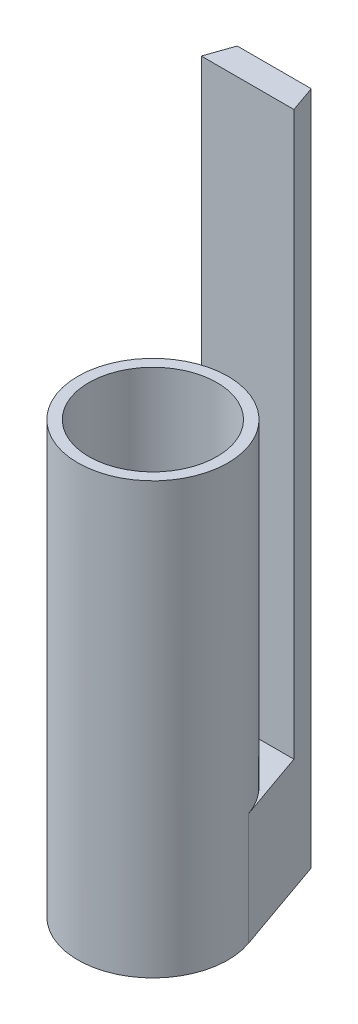
ISO-10303-21;
HEADER;
FILE_DESCRIPTION(('STEP AP214'),'2;1');
FILE_NAME('part.step','',(''),(''),'','','');
FILE_SCHEMA(('AUTOMOTIVE_DESIGN { 1 0 10303 214 1 1 1 1 }'));
ENDSEC;
DATA;
#1=APPLICATION_CONTEXT('core data for automotive mechanical design processes');
#2=APPLICATION_PROTOCOL_DEFINITION('international standard','automotive_design',2000,#1);
#3=PRODUCT_CONTEXT('',#1,'mechanical');
#4=PRODUCT('Part','Part','',(#3));
#5=PRODUCT_RELATED_PRODUCT_CATEGORY('part','',(#4));
#6=PRODUCT_DEFINITION_FORMATION('','',#4);
#7=PRODUCT_DEFINITION_CONTEXT('part definition',#1,'design');
#8=PRODUCT_DEFINITION('design','',#6,#7);
#9=PRODUCT_DEFINITION_SHAPE('','',#8);
#10=(LENGTH_UNIT() NAMED_UNIT(*) SI_UNIT(.MILLI.,.METRE.));
#11=(NAMED_UNIT(*) PLANE_ANGLE_UNIT() SI_UNIT($,.RADIAN.));
#12=(NAMED_UNIT(*) SI_UNIT($,.STERADIAN.) SOLID_ANGLE_UNIT());
#13=UNCERTAINTY_MEASURE_WITH_UNIT(LENGTH_MEASURE(1.E-05),#10,'distance_accuracy_value','');
#14=(GEOMETRIC_REPRESENTATION_CONTEXT(3) GLOBAL_UNCERTAINTY_ASSIGNED_CONTEXT((#13)) GLOBAL_UNIT_ASSIGNED_CONTEXT((#10,
#11,#12)) REPRESENTATION_CONTEXT('',''));
#15=CARTESIAN_POINT('',(0.,0.,0.));
#16=DIRECTION('',(0.,0.,1.));
#17=DIRECTION('',(1.,0.,0.));
#18=AXIS2_PLACEMENT_3D('',#15,#16,#17);
#19=CARTESIAN_POINT('',(0.,8.,0.));
#20=DIRECTION('',(0.,1.,0.));
#21=DIRECTION('',(0.,0.,1.));
#22=AXIS2_PLACEMENT_3D('',#19,#20,#21);
#23=PLANE('',#22);
#24=DIRECTION('',(0.331049570425705,0.,0.94361336463668));
#25=VECTOR('',#24,1.);
#26=CARTESIAN_POINT('',(5.04833150080624,8.,-1.77111520177752));
#27=LINE('',#26,#25);
#28=CARTESIAN_POINT('',(3.30158041034743,8.,-6.75));
#29=VERTEX_POINT('',#28);
#30=CARTESIAN_POINT('',(5.04833150080624,8.,-1.77111520177752));
#31=VERTEX_POINT('',#30);
#32=EDGE_CURVE('E57',#29,#31,#27,.T.);
#33=ORIENTED_EDGE('',*,*,#32,.F.);
#34=DIRECTION('',(1.,0.,0.));
#35=VECTOR('',#34,1.);
#36=CARTESIAN_POINT('',(-3.30158041034743,8.,-6.75));
#37=LINE('',#36,#35);
#38=CARTESIAN_POINT('',(-3.30158041034743,8.,-6.75));
#39=VERTEX_POINT('',#38);
#40=EDGE_CURVE('E108',#39,#29,#37,.T.);
#41=ORIENTED_EDGE('',*,*,#40,.F.);
#42=DIRECTION('',(-0.331049570425705,0.,0.94361336463668));
#43=VECTOR('',#42,1.);
#44=CARTESIAN_POINT('',(-5.04833150080624,8.,-1.77111520177752));
#45=LINE('',#44,#43);
#46=CARTESIAN_POINT('',(-5.04833150080624,8.,-1.77111520177752));
#47=VERTEX_POINT('',#46);
#48=EDGE_CURVE('E49',#39,#47,#45,.T.);
#49=ORIENTED_EDGE('',*,*,#48,.T.);
#50=CARTESIAN_POINT('',(0.,8.,0.));
#51=DIRECTION('',(0.,1.,0.));
#52=DIRECTION('',(0.,0.,1.));
#53=AXIS2_PLACEMENT_3D('',#50,#51,#52);
#54=CIRCLE('',#53,5.35);
#55=EDGE_CURVE('E122',#31,#47,#54,.T.);
#56=ORIENTED_EDGE('',*,*,#55,.F.);
#57=EDGE_LOOP('',(#33,#41,#49,#56));
#58=FACE_BOUND('',#57,.T.);
#59=ADVANCED_FACE('F34',(#58),#23,.T.);
#60=CARTESIAN_POINT('',(0.,30.69,0.));
#61=DIRECTION('',(0.,-1.,0.));
#62=DIRECTION('',(0.,0.,-1.));
#63=AXIS2_PLACEMENT_3D('',#60,#61,#62);
#64=CYLINDRICAL_SURFACE('',#63,4.57);
#65=CARTESIAN_POINT('',(0.,3.48,0.));
#66=DIRECTION('',(0.,1.,0.));
#67=DIRECTION('',(0.,0.,1.));
#68=AXIS2_PLACEMENT_3D('',#65,#66,#67);
#69=CIRCLE('',#68,4.57);
#70=CARTESIAN_POINT('',(0.,3.48,4.57));
#71=VERTEX_POINT('',#70);
#72=EDGE_CURVE('E11',#71,#71,#69,.T.);
#73=ORIENTED_EDGE('',*,*,#72,.F.);
#74=EDGE_LOOP('',(#73));
#75=FACE_BOUND('',#74,.T.);
#76=CARTESIAN_POINT('',(0.,30.69,0.));
#77=DIRECTION('',(0.,1.,0.));
#78=DIRECTION('',(0.,0.,1.));
#79=AXIS2_PLACEMENT_3D('',#76,#77,#78);
#80=CIRCLE('',#79,4.57);
#81=CARTESIAN_POINT('',(0.,30.69,4.57));
#82=VERTEX_POINT('',#81);
#83=EDGE_CURVE('E139',#82,#82,#80,.T.);
#84=ORIENTED_EDGE('',*,*,#83,.T.);
#85=EDGE_LOOP('',(#84));
#86=FACE_BOUND('',#85,.T.);
#87=ADVANCED_FACE('F36',(#75,#86),#64,.F.);
#88=CARTESIAN_POINT('',(0.,30.69,0.));
#89=DIRECTION('',(0.,-1.,0.));
#90=DIRECTION('',(0.,0.,-1.));
#91=AXIS2_PLACEMENT_3D('',#88,#89,#90);
#92=CYLINDRICAL_SURFACE('',#91,5.35);
#93=ORIENTED_EDGE('',*,*,#55,.T.);
#94=DIRECTION('',(0.,-1.,0.));
#95=VECTOR('',#94,1.);
#96=CARTESIAN_POINT('',(-5.04833150080624,8.,-1.77111520177752));
#97=LINE('',#96,#95);
#98=CARTESIAN_POINT('',(-5.04833150080624,0.,-1.77111520177752));
#99=VERTEX_POINT('',#98);
#100=EDGE_CURVE('E133',#47,#99,#97,.T.);
#101=ORIENTED_EDGE('',*,*,#100,.T.);
#102=CARTESIAN_POINT('',(0.,0.,0.));
#103=DIRECTION('',(0.,1.,0.));
#104=DIRECTION('',(0.,0.,1.));
#105=AXIS2_PLACEMENT_3D('',#102,#103,#104);
#106=CIRCLE('',#105,5.35);
#107=CARTESIAN_POINT('',(5.04833150080624,0.,-1.77111520177752));
#108=VERTEX_POINT('',#107);
#109=EDGE_CURVE('E138',#99,#108,#106,.T.);
#110=ORIENTED_EDGE('',*,*,#109,.T.);
#111=DIRECTION('',(0.,-1.,0.));
#112=VECTOR('',#111,1.);
#113=CARTESIAN_POINT('',(5.04833150080624,8.,-1.77111520177752));
#114=LINE('',#113,#112);
#115=EDGE_CURVE('E131',#31,#108,#114,.T.);
#116=ORIENTED_EDGE('',*,*,#115,.F.);
#117=EDGE_LOOP('',(#93,#101,#110,#116));
#118=FACE_BOUND('',#117,.T.);
#119=CARTESIAN_POINT('',(0.,30.69,0.));
#120=DIRECTION('',(0.,1.,0.));
#121=DIRECTION('',(0.,0.,1.));
#122=AXIS2_PLACEMENT_3D('',#119,#120,#121);
#123=CIRCLE('',#122,5.35);
#124=CARTESIAN_POINT('',(0.,30.69,5.35));
#125=VERTEX_POINT('',#124);
#126=EDGE_CURVE('E42',#125,#125,#123,.T.);
#127=ORIENTED_EDGE('',*,*,#126,.F.);
#128=EDGE_LOOP('',(#127));
#129=FACE_BOUND('',#128,.T.);
#130=ADVANCED_FACE('F144',(#118,#129),#92,.T.);
#131=CARTESIAN_POINT('',(0.,30.69,0.));
#132=DIRECTION('',(0.,1.,0.));
#133=DIRECTION('',(0.,0.,1.));
#134=AXIS2_PLACEMENT_3D('',#131,#132,#133);
#135=PLANE('',#134);
#136=ORIENTED_EDGE('',*,*,#83,.F.);
#137=EDGE_LOOP('',(#136));
#138=FACE_BOUND('',#137,.T.);
#139=ORIENTED_EDGE('',*,*,#126,.T.);
#140=EDGE_LOOP('',(#139));
#141=FACE_BOUND('',#140,.T.);
#142=ADVANCED_FACE('F171',(#138,#141),#135,.T.);
#143=CARTESIAN_POINT('',(0.,0.,0.));
#144=DIRECTION('',(0.,1.,0.));
#145=DIRECTION('',(0.,0.,1.));
#146=AXIS2_PLACEMENT_3D('',#143,#144,#145);
#147=PLANE('',#146);
#148=ORIENTED_EDGE('',*,*,#109,.F.);
#149=DIRECTION('',(-0.331049570425705,0.,0.94361336463668));
#150=VECTOR('',#149,1.);
#151=CARTESIAN_POINT('',(-5.04833150080624,0.,-1.77111520177752));
#152=LINE('',#151,#150);
#153=CARTESIAN_POINT('',(-2.635,0.,-8.65));
#154=VERTEX_POINT('',#153);
#155=EDGE_CURVE('E116',#154,#99,#152,.T.);
#156=ORIENTED_EDGE('',*,*,#155,.F.);
#157=DIRECTION('',(1.,0.,0.));
#158=VECTOR('',#157,1.);
#159=CARTESIAN_POINT('',(0.,0.,-8.65));
#160=LINE('',#159,#158);
#161=CARTESIAN_POINT('',(2.635,0.,-8.65));
#162=VERTEX_POINT('',#161);
#163=EDGE_CURVE('E113',#154,#162,#160,.T.);
#164=ORIENTED_EDGE('',*,*,#163,.T.);
#165=DIRECTION('',(0.331049570425705,0.,0.94361336463668));
#166=VECTOR('',#165,1.);
#167=CARTESIAN_POINT('',(5.04833150080624,0.,-1.77111520177752));
#168=LINE('',#167,#166);
#169=EDGE_CURVE('E123',#162,#108,#168,.T.);
#170=ORIENTED_EDGE('',*,*,#169,.T.);
#171=EDGE_LOOP('',(#148,#156,#164,#170));
#172=FACE_BOUND('',#171,.T.);
#173=ADVANCED_FACE('F150',(#172),#147,.F.);
#174=CARTESIAN_POINT('',(0.,8.,-8.65));
#175=DIRECTION('',(0.,0.,-1.));
#176=DIRECTION('',(-1.,0.,0.));
#177=AXIS2_PLACEMENT_3D('',#174,#175,#176);
#178=PLANE('',#177);
#179=ORIENTED_EDGE('',*,*,#163,.F.);
#180=DIRECTION('',(0.,-1.,0.));
#181=VECTOR('',#180,1.);
#182=CARTESIAN_POINT('',(-2.635,8.,-8.65));
#183=LINE('',#182,#181);
#184=CARTESIAN_POINT('',(-2.635,48.11,-8.65));
#185=VERTEX_POINT('',#184);
#186=EDGE_CURVE('E136',#185,#154,#183,.T.);
#187=ORIENTED_EDGE('',*,*,#186,.F.);
#188=DIRECTION('',(-1.,0.,0.));
#189=VECTOR('',#188,1.);
#190=CARTESIAN_POINT('',(-2.635,48.11,-8.65));
#191=LINE('',#190,#189);
#192=CARTESIAN_POINT('',(2.635,48.11,-8.65));
#193=VERTEX_POINT('',#192);
#194=EDGE_CURVE('E106',#193,#185,#191,.T.);
#195=ORIENTED_EDGE('',*,*,#194,.F.);
#196=DIRECTION('',(0.,-1.,0.));
#197=VECTOR('',#196,1.);
#198=CARTESIAN_POINT('',(2.635,8.,-8.65));
#199=LINE('',#198,#197);
#200=EDGE_CURVE('E125',#193,#162,#199,.T.);
#201=ORIENTED_EDGE('',*,*,#200,.T.);
#202=EDGE_LOOP('',(#179,#187,#195,#201));
#203=FACE_BOUND('',#202,.T.);
#204=ADVANCED_FACE('F153',(#203),#178,.T.);
#205=CARTESIAN_POINT('',(-5.04833150080624,8.,-1.77111520177752));
#206=DIRECTION('',(0.94361336463668,0.,0.331049570425705));
#207=DIRECTION('',(0.331049570425705,0.,-0.94361336463668));
#208=AXIS2_PLACEMENT_3D('',#205,#206,#207);
#209=PLANE('',#208);
#210=ORIENTED_EDGE('',*,*,#155,.T.);
#211=ORIENTED_EDGE('',*,*,#100,.F.);
#212=ORIENTED_EDGE('',*,*,#48,.F.);
#213=DIRECTION('',(0.,-1.,0.));
#214=VECTOR('',#213,1.);
#215=CARTESIAN_POINT('',(-3.30158041034743,48.11,-6.75));
#216=LINE('',#215,#214);
#217=CARTESIAN_POINT('',(-3.30158041034743,48.11,-6.75));
#218=VERTEX_POINT('',#217);
#219=EDGE_CURVE('E94',#218,#39,#216,.T.);
#220=ORIENTED_EDGE('',*,*,#219,.F.);
#221=DIRECTION('',(-0.331049570425705,0.,0.94361336463668));
#222=VECTOR('',#221,1.);
#223=CARTESIAN_POINT('',(-3.30158041034743,48.11,-6.75));
#224=LINE('',#223,#222);
#225=EDGE_CURVE('E100',#185,#218,#224,.T.);
#226=ORIENTED_EDGE('',*,*,#225,.F.);
#227=ORIENTED_EDGE('',*,*,#186,.T.);
#228=EDGE_LOOP('',(#210,#211,#212,#220,#226,#227));
#229=FACE_BOUND('',#228,.T.);
#230=ADVANCED_FACE('F111',(#229),#209,.F.);
#231=CARTESIAN_POINT('',(5.04833150080624,8.,-1.77111520177752));
#232=DIRECTION('',(0.94361336463668,0.,-0.331049570425705));
#233=DIRECTION('',(-0.331049570425705,0.,-0.94361336463668));
#234=AXIS2_PLACEMENT_3D('',#231,#232,#233);
#235=PLANE('',#234);
#236=ORIENTED_EDGE('',*,*,#169,.F.);
#237=ORIENTED_EDGE('',*,*,#200,.F.);
#238=DIRECTION('',(-0.331049570425705,0.,-0.94361336463668));
#239=VECTOR('',#238,1.);
#240=CARTESIAN_POINT('',(2.635,48.11,-8.65));
#241=LINE('',#240,#239);
#242=CARTESIAN_POINT('',(3.30158041034743,48.11,-6.75));
#243=VERTEX_POINT('',#242);
#244=EDGE_CURVE('E99',#243,#193,#241,.T.);
#245=ORIENTED_EDGE('',*,*,#244,.F.);
#246=DIRECTION('',(0.,-1.,0.));
#247=VECTOR('',#246,1.);
#248=CARTESIAN_POINT('',(3.30158041034743,48.11,-6.75));
#249=LINE('',#248,#247);
#250=EDGE_CURVE('E95',#243,#29,#249,.T.);
#251=ORIENTED_EDGE('',*,*,#250,.T.);
#252=ORIENTED_EDGE('',*,*,#32,.T.);
#253=ORIENTED_EDGE('',*,*,#115,.T.);
#254=EDGE_LOOP('',(#236,#237,#245,#251,#252,#253));
#255=FACE_BOUND('',#254,.T.);
#256=ADVANCED_FACE('F149',(#255),#235,.T.);
#257=CARTESIAN_POINT('',(-3.30158041034743,48.11,-6.75));
#258=DIRECTION('',(0.,0.,-1.));
#259=DIRECTION('',(-1.,0.,0.));
#260=AXIS2_PLACEMENT_3D('',#257,#258,#259);
#261=PLANE('',#260);
#262=ORIENTED_EDGE('',*,*,#40,.T.);
#263=ORIENTED_EDGE('',*,*,#250,.F.);
#264=DIRECTION('',(1.,0.,0.));
#265=VECTOR('',#264,1.);
#266=CARTESIAN_POINT('',(-3.30158041034743,48.11,-6.75));
#267=LINE('',#266,#265);
#268=EDGE_CURVE('E90',#218,#243,#267,.T.);
#269=ORIENTED_EDGE('',*,*,#268,.F.);
#270=ORIENTED_EDGE('',*,*,#219,.T.);
#271=EDGE_LOOP('',(#262,#263,#269,#270));
#272=FACE_BOUND('',#271,.T.);
#273=ADVANCED_FACE('F92',(#272),#261,.F.);
#274=CARTESIAN_POINT('',(0.,48.11,0.));
#275=DIRECTION('',(0.,-1.,0.));
#276=DIRECTION('',(0.,0.,-1.));
#277=AXIS2_PLACEMENT_3D('',#274,#275,#276);
#278=PLANE('',#277);
#279=ORIENTED_EDGE('',*,*,#225,.T.);
#280=ORIENTED_EDGE('',*,*,#268,.T.);
#281=ORIENTED_EDGE('',*,*,#244,.T.);
#282=ORIENTED_EDGE('',*,*,#194,.T.);
#283=EDGE_LOOP('',(#279,#280,#281,#282));
#284=FACE_BOUND('',#283,.T.);
#285=ADVANCED_FACE('F104',(#284),#278,.F.);
#286=CARTESIAN_POINT('',(0.,3.48,0.));
#287=DIRECTION('',(0.,1.,0.));
#288=DIRECTION('',(0.,0.,1.));
#289=AXIS2_PLACEMENT_3D('',#286,#287,#288);
#290=PLANE('',#289);
#291=ORIENTED_EDGE('',*,*,#72,.T.);
#292=EDGE_LOOP('',(#291));
#293=FACE_BOUND('',#292,.T.);
#294=ADVANCED_FACE('F213',(#293),#290,.T.);
#295=CLOSED_SHELL('',(#59,#87,#130,#142,#173,#204,#230,#256,#273,#285,#294));
#296=MANIFOLD_SOLID_BREP('B2',#295);
#297=ADVANCED_BREP_SHAPE_REPRESENTATION('',(#18,#296),#14);
#298=SHAPE_DEFINITION_REPRESENTATION(#9,#297);
ENDSEC;
END-ISO-10303-21;
